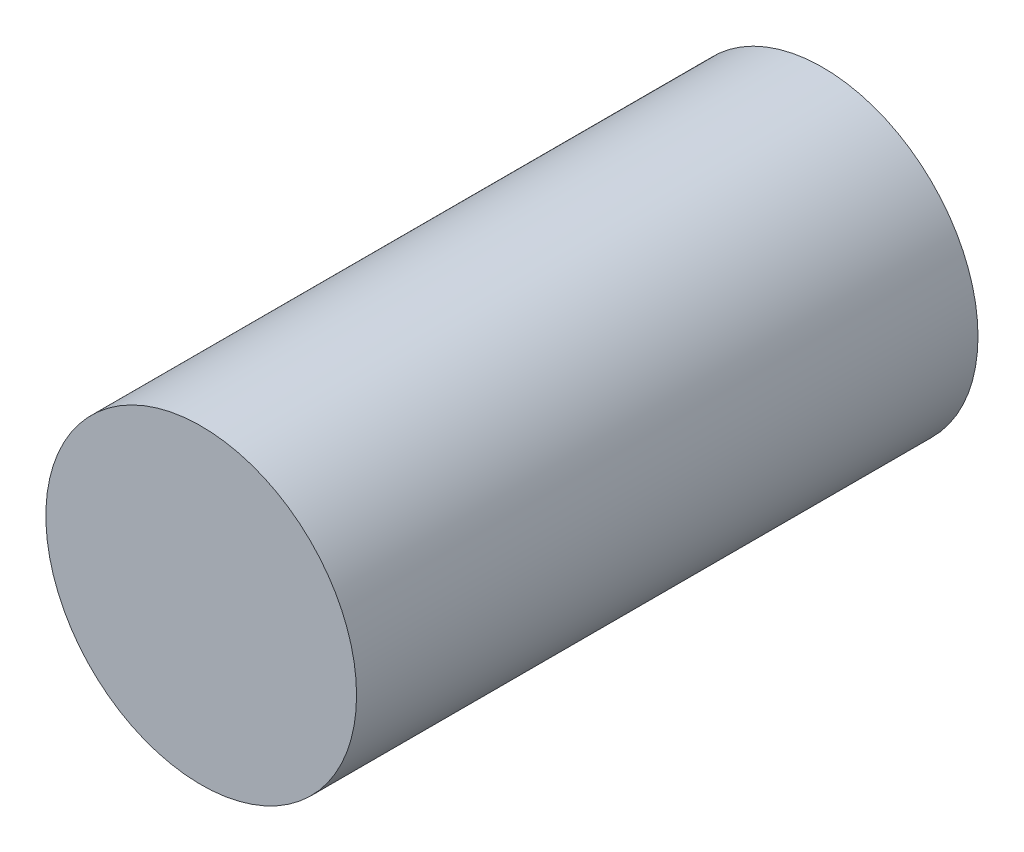
ISO-10303-21;
HEADER;
FILE_DESCRIPTION(('STEP AP214'),'2;1');
FILE_NAME('part.step','',(''),(''),'','','');
FILE_SCHEMA(('AUTOMOTIVE_DESIGN { 1 0 10303 214 1 1 1 1 }'));
ENDSEC;
DATA;
#1=APPLICATION_CONTEXT('core data for automotive mechanical design processes');
#2=APPLICATION_PROTOCOL_DEFINITION('international standard','automotive_design',2000,#1);
#3=PRODUCT_CONTEXT('',#1,'mechanical');
#4=PRODUCT('Part','Part','',(#3));
#5=PRODUCT_RELATED_PRODUCT_CATEGORY('part','',(#4));
#6=PRODUCT_DEFINITION_FORMATION('','',#4);
#7=PRODUCT_DEFINITION_CONTEXT('part definition',#1,'design');
#8=PRODUCT_DEFINITION('design','',#6,#7);
#9=PRODUCT_DEFINITION_SHAPE('','',#8);
#10=(LENGTH_UNIT() NAMED_UNIT(*) SI_UNIT(.MILLI.,.METRE.));
#11=(NAMED_UNIT(*) PLANE_ANGLE_UNIT() SI_UNIT($,.RADIAN.));
#12=(NAMED_UNIT(*) SI_UNIT($,.STERADIAN.) SOLID_ANGLE_UNIT());
#13=UNCERTAINTY_MEASURE_WITH_UNIT(LENGTH_MEASURE(1.E-05),#10,'distance_accuracy_value','');
#14=(GEOMETRIC_REPRESENTATION_CONTEXT(3) GLOBAL_UNCERTAINTY_ASSIGNED_CONTEXT((#13)) GLOBAL_UNIT_ASSIGNED_CONTEXT((#10,
#11,#12)) REPRESENTATION_CONTEXT('',''));
#15=CARTESIAN_POINT('',(0.,0.,0.));
#16=DIRECTION('',(0.,0.,1.));
#17=DIRECTION('',(1.,0.,0.));
#18=AXIS2_PLACEMENT_3D('',#15,#16,#17);
#19=CARTESIAN_POINT('',(0.,0.,70.));
#20=DIRECTION('',(0.,0.,-1.));
#21=DIRECTION('',(-1.,0.,0.));
#22=AXIS2_PLACEMENT_3D('',#19,#20,#21);
#23=CYLINDRICAL_SURFACE('',#22,17.5);
#24=CARTESIAN_POINT('',(0.,0.,70.));
#25=DIRECTION('',(0.,0.,1.));
#26=DIRECTION('',(1.,0.,0.));
#27=AXIS2_PLACEMENT_3D('',#24,#25,#26);
#28=CIRCLE('',#27,17.5);
#29=CARTESIAN_POINT('',(17.5,0.,70.));
#30=VERTEX_POINT('',#29);
#31=EDGE_CURVE('E10',#30,#30,#28,.T.);
#32=ORIENTED_EDGE('',*,*,#31,.F.);
#33=EDGE_LOOP('',(#32));
#34=FACE_BOUND('',#33,.T.);
#35=CARTESIAN_POINT('',(0.,0.,0.));
#36=DIRECTION('',(0.,0.,1.));
#37=DIRECTION('',(1.,0.,0.));
#38=AXIS2_PLACEMENT_3D('',#35,#36,#37);
#39=CIRCLE('',#38,17.5);
#40=CARTESIAN_POINT('',(17.5,0.,0.));
#41=VERTEX_POINT('',#40);
#42=EDGE_CURVE('E34',#41,#41,#39,.T.);
#43=ORIENTED_EDGE('',*,*,#42,.T.);
#44=EDGE_LOOP('',(#43));
#45=FACE_BOUND('',#44,.T.);
#46=ADVANCED_FACE('F31',(#34,#45),#23,.T.);
#47=CARTESIAN_POINT('',(0.,0.,70.));
#48=DIRECTION('',(0.,0.,1.));
#49=DIRECTION('',(1.,0.,0.));
#50=AXIS2_PLACEMENT_3D('',#47,#48,#49);
#51=PLANE('',#50);
#52=ORIENTED_EDGE('',*,*,#31,.T.);
#53=EDGE_LOOP('',(#52));
#54=FACE_BOUND('',#53,.T.);
#55=ADVANCED_FACE('F46',(#54),#51,.T.);
#56=CARTESIAN_POINT('',(0.,0.,0.));
#57=DIRECTION('',(0.,0.,1.));
#58=DIRECTION('',(1.,0.,0.));
#59=AXIS2_PLACEMENT_3D('',#56,#57,#58);
#60=PLANE('',#59);
#61=ORIENTED_EDGE('',*,*,#42,.F.);
#62=EDGE_LOOP('',(#61));
#63=FACE_BOUND('',#62,.T.);
#64=ADVANCED_FACE('F44',(#63),#60,.F.);
#65=CLOSED_SHELL('',(#46,#55,#64));
#66=MANIFOLD_SOLID_BREP('B2',#65);
#67=ADVANCED_BREP_SHAPE_REPRESENTATION('',(#18,#66),#14);
#68=SHAPE_DEFINITION_REPRESENTATION(#9,#67);
ENDSEC;
END-ISO-10303-21;
